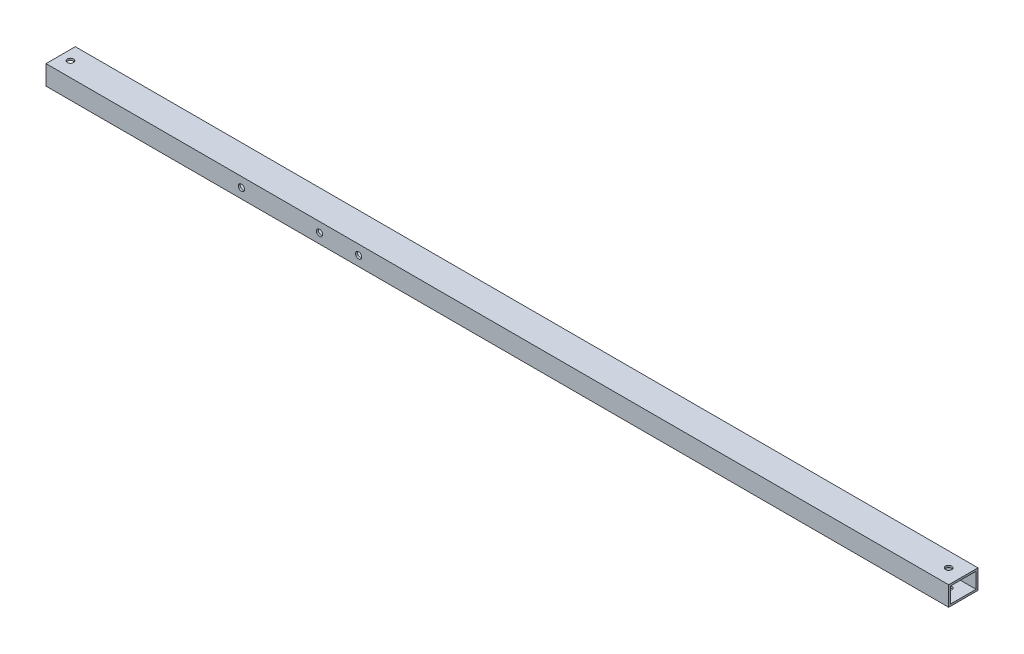
ISO-10303-21;
HEADER;
FILE_DESCRIPTION(('STEP AP214'),'2;1');
FILE_NAME('part.step','',(''),(''),'','','');
FILE_SCHEMA(('AUTOMOTIVE_DESIGN { 1 0 10303 214 1 1 1 1 }'));
ENDSEC;
DATA;
#1=APPLICATION_CONTEXT('core data for automotive mechanical design processes');
#2=APPLICATION_PROTOCOL_DEFINITION('international standard','automotive_design',2000,#1);
#3=PRODUCT_CONTEXT('',#1,'mechanical');
#4=PRODUCT('Part','Part','',(#3));
#5=PRODUCT_RELATED_PRODUCT_CATEGORY('part','',(#4));
#6=PRODUCT_DEFINITION_FORMATION('','',#4);
#7=PRODUCT_DEFINITION_CONTEXT('part definition',#1,'design');
#8=PRODUCT_DEFINITION('design','',#6,#7);
#9=PRODUCT_DEFINITION_SHAPE('','',#8);
#10=(LENGTH_UNIT() NAMED_UNIT(*) SI_UNIT(.MILLI.,.METRE.));
#11=(NAMED_UNIT(*) PLANE_ANGLE_UNIT() SI_UNIT($,.RADIAN.));
#12=(NAMED_UNIT(*) SI_UNIT($,.STERADIAN.) SOLID_ANGLE_UNIT());
#13=UNCERTAINTY_MEASURE_WITH_UNIT(LENGTH_MEASURE(1.E-05),#10,'distance_accuracy_value','');
#14=(GEOMETRIC_REPRESENTATION_CONTEXT(3) GLOBAL_UNCERTAINTY_ASSIGNED_CONTEXT((#13)) GLOBAL_UNIT_ASSIGNED_CONTEXT((#10,
#11,#12)) REPRESENTATION_CONTEXT('',''));
#15=CARTESIAN_POINT('',(0.,0.,0.));
#16=DIRECTION('',(0.,0.,1.));
#17=DIRECTION('',(1.,0.,0.));
#18=AXIS2_PLACEMENT_3D('',#15,#16,#17);
#19=CARTESIAN_POINT('',(-265.5,5.00000000000003,7.5));
#20=DIRECTION('',(0.,-1.,0.));
#21=DIRECTION('',(1.,0.,0.));
#22=AXIS2_PLACEMENT_3D('',#19,#20,#21);
#23=CYLINDRICAL_SURFACE('',#22,1.59999999999996);
#24=CARTESIAN_POINT('',(-265.5,-4.00000000000003,7.5));
#25=DIRECTION('',(0.,-1.,0.));
#26=DIRECTION('',(0.,0.,-1.));
#27=AXIS2_PLACEMENT_3D('',#24,#25,#26);
#28=CIRCLE('',#27,1.59999999999996);
#29=CARTESIAN_POINT('',(-265.5,-4.00000000000003,5.90000000000003));
#30=VERTEX_POINT('',#29);
#31=EDGE_CURVE('E115',#30,#30,#28,.F.);
#32=ORIENTED_EDGE('',*,*,#31,.T.);
#33=EDGE_LOOP('',(#32));
#34=FACE_BOUND('',#33,.T.);
#35=CARTESIAN_POINT('',(-265.5,-4.99999999999997,7.5));
#36=DIRECTION('',(0.,-1.,0.));
#37=DIRECTION('',(1.,0.,0.));
#38=AXIS2_PLACEMENT_3D('',#35,#36,#37);
#39=CIRCLE('',#38,1.59999999999996);
#40=CARTESIAN_POINT('',(-263.9,-4.99999999999997,7.5));
#41=VERTEX_POINT('',#40);
#42=EDGE_CURVE('E125',#41,#41,#39,.T.);
#43=ORIENTED_EDGE('',*,*,#42,.T.);
#44=EDGE_LOOP('',(#43));
#45=FACE_BOUND('',#44,.T.);
#46=ADVANCED_FACE('F33',(#34,#45),#23,.F.);
#47=CARTESIAN_POINT('',(-620.,0.,15.));
#48=DIRECTION('',(0.,0.,-1.));
#49=DIRECTION('',(-1.,0.,0.));
#50=AXIS2_PLACEMENT_3D('',#47,#48,#49);
#51=CYLINDRICAL_SURFACE('',#50,1.60000000000002);
#52=CARTESIAN_POINT('',(-620.,0.,1.));
#53=DIRECTION('',(0.,0.,-1.));
#54=DIRECTION('',(0.,1.,0.));
#55=AXIS2_PLACEMENT_3D('',#52,#53,#54);
#56=CIRCLE('',#55,1.60000000000002);
#57=CARTESIAN_POINT('',(-620.,1.60000000000002,1.));
#58=VERTEX_POINT('',#57);
#59=EDGE_CURVE('E170',#58,#58,#56,.T.);
#60=ORIENTED_EDGE('',*,*,#59,.F.);
#61=EDGE_LOOP('',(#60));
#62=FACE_BOUND('',#61,.T.);
#63=CARTESIAN_POINT('',(-620.,0.,0.));
#64=DIRECTION('',(0.,0.,1.));
#65=DIRECTION('',(1.,0.,0.));
#66=AXIS2_PLACEMENT_3D('',#63,#64,#65);
#67=CIRCLE('',#66,1.60000000000002);
#68=CARTESIAN_POINT('',(-618.4,0.,0.));
#69=VERTEX_POINT('',#68);
#70=EDGE_CURVE('E185',#69,#69,#67,.T.);
#71=ORIENTED_EDGE('',*,*,#70,.F.);
#72=EDGE_LOOP('',(#71));
#73=FACE_BOUND('',#72,.T.);
#74=ADVANCED_FACE('F264',(#62,#73),#51,.F.);
#75=CARTESIAN_POINT('',(-580.,0.,15.));
#76=DIRECTION('',(0.,0.,-1.));
#77=DIRECTION('',(-1.,0.,0.));
#78=AXIS2_PLACEMENT_3D('',#75,#76,#77);
#79=CYLINDRICAL_SURFACE('',#78,1.59999999999991);
#80=CARTESIAN_POINT('',(-580.,0.,1.));
#81=DIRECTION('',(0.,0.,-1.));
#82=DIRECTION('',(0.,1.,0.));
#83=AXIS2_PLACEMENT_3D('',#80,#81,#82);
#84=CIRCLE('',#83,1.59999999999991);
#85=CARTESIAN_POINT('',(-580.,1.59999999999991,1.));
#86=VERTEX_POINT('',#85);
#87=EDGE_CURVE('E167',#86,#86,#84,.T.);
#88=ORIENTED_EDGE('',*,*,#87,.F.);
#89=EDGE_LOOP('',(#88));
#90=FACE_BOUND('',#89,.T.);
#91=CARTESIAN_POINT('',(-580.,0.,0.));
#92=DIRECTION('',(0.,0.,1.));
#93=DIRECTION('',(1.,0.,0.));
#94=AXIS2_PLACEMENT_3D('',#91,#92,#93);
#95=CIRCLE('',#94,1.59999999999991);
#96=CARTESIAN_POINT('',(-578.4,0.,0.));
#97=VERTEX_POINT('',#96);
#98=EDGE_CURVE('E179',#97,#97,#95,.T.);
#99=ORIENTED_EDGE('',*,*,#98,.F.);
#100=EDGE_LOOP('',(#99));
#101=FACE_BOUND('',#100,.T.);
#102=ADVANCED_FACE('F271',(#90,#101),#79,.F.);
#103=CARTESIAN_POINT('',(-560.,0.,15.));
#104=DIRECTION('',(0.,0.,-1.));
#105=DIRECTION('',(-1.,0.,0.));
#106=AXIS2_PLACEMENT_3D('',#103,#104,#105);
#107=CYLINDRICAL_SURFACE('',#106,1.60000000000002);
#108=CARTESIAN_POINT('',(-560.,0.,1.));
#109=DIRECTION('',(0.,0.,-1.));
#110=DIRECTION('',(0.,1.,0.));
#111=AXIS2_PLACEMENT_3D('',#108,#109,#110);
#112=CIRCLE('',#111,1.60000000000002);
#113=CARTESIAN_POINT('',(-560.,1.60000000000002,1.));
#114=VERTEX_POINT('',#113);
#115=EDGE_CURVE('E166',#114,#114,#112,.T.);
#116=ORIENTED_EDGE('',*,*,#115,.F.);
#117=EDGE_LOOP('',(#116));
#118=FACE_BOUND('',#117,.T.);
#119=CARTESIAN_POINT('',(-560.,0.,0.));
#120=DIRECTION('',(0.,0.,1.));
#121=DIRECTION('',(1.,0.,0.));
#122=AXIS2_PLACEMENT_3D('',#119,#120,#121);
#123=CIRCLE('',#122,1.60000000000002);
#124=CARTESIAN_POINT('',(-558.4,0.,0.));
#125=VERTEX_POINT('',#124);
#126=EDGE_CURVE('E175',#125,#125,#123,.T.);
#127=ORIENTED_EDGE('',*,*,#126,.F.);
#128=EDGE_LOOP('',(#127));
#129=FACE_BOUND('',#128,.T.);
#130=ADVANCED_FACE('F291',(#118,#129),#107,.F.);
#131=CARTESIAN_POINT('',(0.,0.,15.));
#132=DIRECTION('',(0.,0.,-1.));
#133=DIRECTION('',(-1.,0.,0.));
#134=AXIS2_PLACEMENT_3D('',#131,#132,#133);
#135=PLANE('',#134);
#136=DIRECTION('',(1.,0.,0.));
#137=VECTOR('',#136,1.);
#138=CARTESIAN_POINT('',(-500.,-5.,15.));
#139=LINE('',#138,#137);
#140=CARTESIAN_POINT('',(-720.,-5.00000000000003,15.));
#141=VERTEX_POINT('',#140);
#142=CARTESIAN_POINT('',(-258.,-4.99999999999997,15.));
#143=VERTEX_POINT('',#142);
#144=EDGE_CURVE('E199',#141,#143,#139,.T.);
#145=ORIENTED_EDGE('',*,*,#144,.T.);
#146=DIRECTION('',(0.,-1.,0.));
#147=VECTOR('',#146,1.);
#148=CARTESIAN_POINT('',(-258.,5.00000000000003,15.));
#149=LINE('',#148,#147);
#150=CARTESIAN_POINT('',(-258.,5.00000000000003,15.));
#151=VERTEX_POINT('',#150);
#152=EDGE_CURVE('E138',#151,#143,#149,.T.);
#153=ORIENTED_EDGE('',*,*,#152,.F.);
#154=DIRECTION('',(-1.,0.,0.));
#155=VECTOR('',#154,1.);
#156=CARTESIAN_POINT('',(-500.,5.,15.));
#157=LINE('',#156,#155);
#158=CARTESIAN_POINT('',(-720.,4.99999999999997,15.));
#159=VERTEX_POINT('',#158);
#160=EDGE_CURVE('E194',#151,#159,#157,.T.);
#161=ORIENTED_EDGE('',*,*,#160,.T.);
#162=DIRECTION('',(0.,-1.,0.));
#163=VECTOR('',#162,1.);
#164=CARTESIAN_POINT('',(-720.,4.99999999999997,15.));
#165=LINE('',#164,#163);
#166=EDGE_CURVE('E196',#159,#141,#165,.T.);
#167=ORIENTED_EDGE('',*,*,#166,.T.);
#168=EDGE_LOOP('',(#145,#153,#161,#167));
#169=FACE_BOUND('',#168,.T.);
#170=CARTESIAN_POINT('',(-620.,0.,15.));
#171=DIRECTION('',(0.,0.,1.));
#172=DIRECTION('',(1.,0.,0.));
#173=AXIS2_PLACEMENT_3D('',#170,#171,#172);
#174=CIRCLE('',#173,1.60000000000002);
#175=CARTESIAN_POINT('',(-618.4,0.,15.));
#176=VERTEX_POINT('',#175);
#177=EDGE_CURVE('E188',#176,#176,#174,.T.);
#178=ORIENTED_EDGE('',*,*,#177,.F.);
#179=EDGE_LOOP('',(#178));
#180=FACE_BOUND('',#179,.T.);
#181=CARTESIAN_POINT('',(-580.,0.,15.));
#182=DIRECTION('',(0.,0.,1.));
#183=DIRECTION('',(1.,0.,0.));
#184=AXIS2_PLACEMENT_3D('',#181,#182,#183);
#185=CIRCLE('',#184,1.59999999999991);
#186=CARTESIAN_POINT('',(-578.4,0.,15.));
#187=VERTEX_POINT('',#186);
#188=EDGE_CURVE('E182',#187,#187,#185,.T.);
#189=ORIENTED_EDGE('',*,*,#188,.F.);
#190=EDGE_LOOP('',(#189));
#191=FACE_BOUND('',#190,.T.);
#192=CARTESIAN_POINT('',(-560.,0.,15.));
#193=DIRECTION('',(0.,0.,1.));
#194=DIRECTION('',(1.,0.,0.));
#195=AXIS2_PLACEMENT_3D('',#192,#193,#194);
#196=CIRCLE('',#195,1.60000000000002);
#197=CARTESIAN_POINT('',(-558.4,0.,15.));
#198=VERTEX_POINT('',#197);
#199=EDGE_CURVE('E176',#198,#198,#196,.T.);
#200=ORIENTED_EDGE('',*,*,#199,.F.);
#201=EDGE_LOOP('',(#200));
#202=FACE_BOUND('',#201,.T.);
#203=ADVANCED_FACE('F246',(#169,#180,#191,#202),#135,.F.);
#204=CARTESIAN_POINT('',(0.,0.,0.));
#205=DIRECTION('',(0.,0.,-1.));
#206=DIRECTION('',(-1.,0.,0.));
#207=AXIS2_PLACEMENT_3D('',#204,#205,#206);
#208=PLANE('',#207);
#209=ORIENTED_EDGE('',*,*,#98,.T.);
#210=EDGE_LOOP('',(#209));
#211=FACE_BOUND('',#210,.T.);
#212=DIRECTION('',(-1.,0.,0.));
#213=VECTOR('',#212,1.);
#214=CARTESIAN_POINT('',(-500.,5.,0.));
#215=LINE('',#214,#213);
#216=CARTESIAN_POINT('',(-258.,5.00000000000003,0.));
#217=VERTEX_POINT('',#216);
#218=CARTESIAN_POINT('',(-720.,4.99999999999997,0.));
#219=VERTEX_POINT('',#218);
#220=EDGE_CURVE('E191',#217,#219,#215,.T.);
#221=ORIENTED_EDGE('',*,*,#220,.F.);
#222=DIRECTION('',(0.,-1.,0.));
#223=VECTOR('',#222,1.);
#224=CARTESIAN_POINT('',(-258.,5.00000000000003,0.));
#225=LINE('',#224,#223);
#226=CARTESIAN_POINT('',(-258.,-4.99999999999997,0.));
#227=VERTEX_POINT('',#226);
#228=EDGE_CURVE('E135',#217,#227,#225,.T.);
#229=ORIENTED_EDGE('',*,*,#228,.T.);
#230=DIRECTION('',(1.,0.,0.));
#231=VECTOR('',#230,1.);
#232=CARTESIAN_POINT('',(-500.,-5.,0.));
#233=LINE('',#232,#231);
#234=CARTESIAN_POINT('',(-720.,-5.00000000000003,0.));
#235=VERTEX_POINT('',#234);
#236=EDGE_CURVE('E197',#235,#227,#233,.T.);
#237=ORIENTED_EDGE('',*,*,#236,.F.);
#238=DIRECTION('',(0.,-1.,0.));
#239=VECTOR('',#238,1.);
#240=CARTESIAN_POINT('',(-720.,4.99999999999997,0.));
#241=LINE('',#240,#239);
#242=EDGE_CURVE('E203',#219,#235,#241,.T.);
#243=ORIENTED_EDGE('',*,*,#242,.F.);
#244=EDGE_LOOP('',(#221,#229,#237,#243));
#245=FACE_BOUND('',#244,.T.);
#246=ORIENTED_EDGE('',*,*,#70,.T.);
#247=EDGE_LOOP('',(#246));
#248=FACE_BOUND('',#247,.T.);
#249=ORIENTED_EDGE('',*,*,#126,.T.);
#250=EDGE_LOOP('',(#249));
#251=FACE_BOUND('',#250,.T.);
#252=ADVANCED_FACE('F239',(#211,#245,#248,#251),#208,.T.);
#253=CARTESIAN_POINT('',(-500.,5.,15.));
#254=DIRECTION('',(0.,-1.,0.));
#255=DIRECTION('',(1.,0.,0.));
#256=AXIS2_PLACEMENT_3D('',#253,#254,#255);
#257=PLANE('',#256);
#258=CARTESIAN_POINT('',(-715.,5.,7.5));
#259=DIRECTION('',(0.,-1.,0.));
#260=DIRECTION('',(1.,0.,0.));
#261=AXIS2_PLACEMENT_3D('',#258,#259,#260);
#262=CIRCLE('',#261,1.60000000000002);
#263=CARTESIAN_POINT('',(-713.4,5.,7.5));
#264=VERTEX_POINT('',#263);
#265=EDGE_CURVE('E104',#264,#264,#262,.T.);
#266=ORIENTED_EDGE('',*,*,#265,.T.);
#267=EDGE_LOOP('',(#266));
#268=FACE_BOUND('',#267,.T.);
#269=ORIENTED_EDGE('',*,*,#220,.T.);
#270=DIRECTION('',(0.,0.,-1.));
#271=VECTOR('',#270,1.);
#272=CARTESIAN_POINT('',(-720.,4.99999999999997,15.));
#273=LINE('',#272,#271);
#274=EDGE_CURVE('E208',#159,#219,#273,.T.);
#275=ORIENTED_EDGE('',*,*,#274,.F.);
#276=ORIENTED_EDGE('',*,*,#160,.F.);
#277=DIRECTION('',(0.,0.,1.));
#278=VECTOR('',#277,1.);
#279=CARTESIAN_POINT('',(-258.,5.00000000000003,0.));
#280=LINE('',#279,#278);
#281=EDGE_CURVE('E132',#217,#151,#280,.T.);
#282=ORIENTED_EDGE('',*,*,#281,.F.);
#283=EDGE_LOOP('',(#269,#275,#276,#282));
#284=FACE_BOUND('',#283,.T.);
#285=CARTESIAN_POINT('',(-265.5,5.00000000000003,7.5));
#286=DIRECTION('',(0.,-1.,0.));
#287=DIRECTION('',(1.,0.,0.));
#288=AXIS2_PLACEMENT_3D('',#285,#286,#287);
#289=CIRCLE('',#288,1.59999999999996);
#290=CARTESIAN_POINT('',(-263.9,5.00000000000003,7.5));
#291=VERTEX_POINT('',#290);
#292=EDGE_CURVE('E126',#291,#291,#289,.T.);
#293=ORIENTED_EDGE('',*,*,#292,.T.);
#294=EDGE_LOOP('',(#293));
#295=FACE_BOUND('',#294,.T.);
#296=ADVANCED_FACE('F35',(#268,#284,#295),#257,.F.);
#297=CARTESIAN_POINT('',(-720.,4.99999999999997,15.));
#298=DIRECTION('',(1.,0.,0.));
#299=DIRECTION('',(0.,0.,-1.));
#300=AXIS2_PLACEMENT_3D('',#297,#298,#299);
#301=PLANE('',#300);
#302=DIRECTION('',(0.,0.,-1.));
#303=VECTOR('',#302,1.);
#304=CARTESIAN_POINT('',(-720.,-4.,15.));
#305=LINE('',#304,#303);
#306=CARTESIAN_POINT('',(-720.,-4.,14.));
#307=VERTEX_POINT('',#306);
#308=CARTESIAN_POINT('',(-720.,-4.,0.999999999999999));
#309=VERTEX_POINT('',#308);
#310=EDGE_CURVE('E216',#307,#309,#305,.T.);
#311=ORIENTED_EDGE('',*,*,#310,.T.);
#312=DIRECTION('',(0.,1.,0.));
#313=VECTOR('',#312,1.);
#314=CARTESIAN_POINT('',(-720.,4.99999999999998,1.));
#315=LINE('',#314,#313);
#316=CARTESIAN_POINT('',(-720.,4.,1.));
#317=VERTEX_POINT('',#316);
#318=EDGE_CURVE('E173',#309,#317,#315,.T.);
#319=ORIENTED_EDGE('',*,*,#318,.T.);
#320=DIRECTION('',(0.,0.,1.));
#321=VECTOR('',#320,1.);
#322=CARTESIAN_POINT('',(-720.,4.,15.));
#323=LINE('',#322,#321);
#324=CARTESIAN_POINT('',(-720.,4.,14.));
#325=VERTEX_POINT('',#324);
#326=EDGE_CURVE('E101',#317,#325,#323,.T.);
#327=ORIENTED_EDGE('',*,*,#326,.T.);
#328=DIRECTION('',(0.,-1.,0.));
#329=VECTOR('',#328,1.);
#330=CARTESIAN_POINT('',(-720.,4.99999999999998,14.));
#331=LINE('',#330,#329);
#332=EDGE_CURVE('E163',#325,#307,#331,.T.);
#333=ORIENTED_EDGE('',*,*,#332,.T.);
#334=EDGE_LOOP('',(#311,#319,#327,#333));
#335=FACE_BOUND('',#334,.T.);
#336=ORIENTED_EDGE('',*,*,#242,.T.);
#337=DIRECTION('',(0.,0.,-1.));
#338=VECTOR('',#337,1.);
#339=CARTESIAN_POINT('',(-720.,-5.00000000000003,15.));
#340=LINE('',#339,#338);
#341=EDGE_CURVE('E201',#141,#235,#340,.T.);
#342=ORIENTED_EDGE('',*,*,#341,.F.);
#343=ORIENTED_EDGE('',*,*,#166,.F.);
#344=ORIENTED_EDGE('',*,*,#274,.T.);
#345=EDGE_LOOP('',(#336,#342,#343,#344));
#346=FACE_BOUND('',#345,.T.);
#347=ADVANCED_FACE('F226',(#335,#346),#301,.F.);
#348=CARTESIAN_POINT('',(-500.,-5.,15.));
#349=DIRECTION('',(0.,1.,0.));
#350=DIRECTION('',(-1.,0.,0.));
#351=AXIS2_PLACEMENT_3D('',#348,#349,#350);
#352=PLANE('',#351);
#353=CARTESIAN_POINT('',(-715.,-5.00000000000003,7.5));
#354=DIRECTION('',(0.,-1.,0.));
#355=DIRECTION('',(1.,0.,0.));
#356=AXIS2_PLACEMENT_3D('',#353,#354,#355);
#357=CIRCLE('',#356,1.60000000000002);
#358=CARTESIAN_POINT('',(-713.4,-5.00000000000003,7.5));
#359=VERTEX_POINT('',#358);
#360=EDGE_CURVE('E141',#359,#359,#357,.T.);
#361=ORIENTED_EDGE('',*,*,#360,.F.);
#362=EDGE_LOOP('',(#361));
#363=FACE_BOUND('',#362,.T.);
#364=ORIENTED_EDGE('',*,*,#236,.T.);
#365=DIRECTION('',(0.,0.,1.));
#366=VECTOR('',#365,1.);
#367=CARTESIAN_POINT('',(-258.,-4.99999999999997,0.));
#368=LINE('',#367,#366);
#369=EDGE_CURVE('E129',#227,#143,#368,.T.);
#370=ORIENTED_EDGE('',*,*,#369,.T.);
#371=ORIENTED_EDGE('',*,*,#144,.F.);
#372=ORIENTED_EDGE('',*,*,#341,.T.);
#373=EDGE_LOOP('',(#364,#370,#371,#372));
#374=FACE_BOUND('',#373,.T.);
#375=ORIENTED_EDGE('',*,*,#42,.F.);
#376=EDGE_LOOP('',(#375));
#377=FACE_BOUND('',#376,.T.);
#378=ADVANCED_FACE('F229',(#363,#374,#377),#352,.F.);
#379=CARTESIAN_POINT('',(-620.,0.,14.));
#380=DIRECTION('',(0.,0.,1.));
#381=DIRECTION('',(0.,-1.,0.));
#382=AXIS2_PLACEMENT_3D('',#379,#380,#381);
#383=CIRCLE('',#382,1.60000000000002);
#384=CARTESIAN_POINT('',(-620.,-1.60000000000002,14.));
#385=VERTEX_POINT('',#384);
#386=EDGE_CURVE('E160',#385,#385,#383,.T.);
#387=ORIENTED_EDGE('',*,*,#386,.F.);
#388=EDGE_LOOP('',(#387));
#389=FACE_BOUND('',#388,.T.);
#390=ORIENTED_EDGE('',*,*,#177,.T.);
#391=EDGE_LOOP('',(#390));
#392=FACE_BOUND('',#391,.T.);
#393=ADVANCED_FACE('F274',(#389,#392),#51,.F.);
#394=CARTESIAN_POINT('',(-580.,0.,14.));
#395=DIRECTION('',(0.,0.,1.));
#396=DIRECTION('',(0.,-1.,0.));
#397=AXIS2_PLACEMENT_3D('',#394,#395,#396);
#398=CIRCLE('',#397,1.59999999999991);
#399=CARTESIAN_POINT('',(-580.,-1.59999999999991,14.));
#400=VERTEX_POINT('',#399);
#401=EDGE_CURVE('E157',#400,#400,#398,.T.);
#402=ORIENTED_EDGE('',*,*,#401,.F.);
#403=EDGE_LOOP('',(#402));
#404=FACE_BOUND('',#403,.T.);
#405=ORIENTED_EDGE('',*,*,#188,.T.);
#406=EDGE_LOOP('',(#405));
#407=FACE_BOUND('',#406,.T.);
#408=ADVANCED_FACE('F283',(#404,#407),#79,.F.);
#409=CARTESIAN_POINT('',(-560.,0.,14.));
#410=DIRECTION('',(0.,0.,1.));
#411=DIRECTION('',(0.,-1.,0.));
#412=AXIS2_PLACEMENT_3D('',#409,#410,#411);
#413=CIRCLE('',#412,1.60000000000002);
#414=CARTESIAN_POINT('',(-560.,-1.60000000000002,14.));
#415=VERTEX_POINT('',#414);
#416=EDGE_CURVE('E153',#415,#415,#413,.T.);
#417=ORIENTED_EDGE('',*,*,#416,.F.);
#418=EDGE_LOOP('',(#417));
#419=FACE_BOUND('',#418,.T.);
#420=ORIENTED_EDGE('',*,*,#199,.T.);
#421=EDGE_LOOP('',(#420));
#422=FACE_BOUND('',#421,.T.);
#423=ADVANCED_FACE('F295',(#419,#422),#107,.F.);
#424=CARTESIAN_POINT('',(-2500.,-4.,0.999999999999999));
#425=DIRECTION('',(0.,-1.,0.));
#426=DIRECTION('',(0.,0.,-1.));
#427=AXIS2_PLACEMENT_3D('',#424,#425,#426);
#428=PLANE('',#427);
#429=CARTESIAN_POINT('',(-715.,-4.,7.5));
#430=DIRECTION('',(0.,-1.,0.));
#431=DIRECTION('',(0.,0.,-1.));
#432=AXIS2_PLACEMENT_3D('',#429,#430,#431);
#433=CIRCLE('',#432,1.60000000000002);
#434=CARTESIAN_POINT('',(-715.,-4.,5.89999999999998));
#435=VERTEX_POINT('',#434);
#436=EDGE_CURVE('E147',#435,#435,#433,.T.);
#437=ORIENTED_EDGE('',*,*,#436,.T.);
#438=EDGE_LOOP('',(#437));
#439=FACE_BOUND('',#438,.T.);
#440=DIRECTION('',(1.,0.,0.));
#441=VECTOR('',#440,1.);
#442=CARTESIAN_POINT('',(-2500.,-4.,14.));
#443=LINE('',#442,#441);
#444=CARTESIAN_POINT('',(-258.,-4.00000000000003,14.));
#445=VERTEX_POINT('',#444);
#446=EDGE_CURVE('E154',#307,#445,#443,.T.);
#447=ORIENTED_EDGE('',*,*,#446,.T.);
#448=DIRECTION('',(0.,0.,-1.));
#449=VECTOR('',#448,1.);
#450=CARTESIAN_POINT('',(-258.,-4.00000000000003,0.));
#451=LINE('',#450,#449);
#452=CARTESIAN_POINT('',(-258.,-4.00000000000003,1.));
#453=VERTEX_POINT('',#452);
#454=EDGE_CURVE('E119',#445,#453,#451,.T.);
#455=ORIENTED_EDGE('',*,*,#454,.T.);
#456=DIRECTION('',(1.,0.,0.));
#457=VECTOR('',#456,1.);
#458=CARTESIAN_POINT('',(-2500.,-4.,0.999999999999999));
#459=LINE('',#458,#457);
#460=EDGE_CURVE('E109',#309,#453,#459,.T.);
#461=ORIENTED_EDGE('',*,*,#460,.F.);
#462=ORIENTED_EDGE('',*,*,#310,.F.);
#463=EDGE_LOOP('',(#447,#455,#461,#462));
#464=FACE_BOUND('',#463,.T.);
#465=ORIENTED_EDGE('',*,*,#31,.F.);
#466=EDGE_LOOP('',(#465));
#467=FACE_BOUND('',#466,.T.);
#468=ADVANCED_FACE('F223',(#439,#464,#467),#428,.F.);
#469=CARTESIAN_POINT('',(-2500.,4.,1.));
#470=DIRECTION('',(0.,1.,0.));
#471=DIRECTION('',(0.,0.,1.));
#472=AXIS2_PLACEMENT_3D('',#469,#470,#471);
#473=PLANE('',#472);
#474=CARTESIAN_POINT('',(-715.,4.,7.5));
#475=DIRECTION('',(0.,1.,0.));
#476=DIRECTION('',(0.,0.,1.));
#477=AXIS2_PLACEMENT_3D('',#474,#475,#476);
#478=CIRCLE('',#477,1.60000000000002);
#479=CARTESIAN_POINT('',(-715.,4.,9.10000000000002));
#480=VERTEX_POINT('',#479);
#481=EDGE_CURVE('E146',#480,#480,#478,.T.);
#482=ORIENTED_EDGE('',*,*,#481,.T.);
#483=EDGE_LOOP('',(#482));
#484=FACE_BOUND('',#483,.T.);
#485=DIRECTION('',(1.,0.,0.));
#486=VECTOR('',#485,1.);
#487=CARTESIAN_POINT('',(-2500.,4.,1.));
#488=LINE('',#487,#486);
#489=CARTESIAN_POINT('',(-258.,3.99999999999997,1.));
#490=VERTEX_POINT('',#489);
#491=EDGE_CURVE('E94',#317,#490,#488,.T.);
#492=ORIENTED_EDGE('',*,*,#491,.T.);
#493=DIRECTION('',(0.,0.,1.));
#494=VECTOR('',#493,1.);
#495=CARTESIAN_POINT('',(-258.,3.99999999999997,0.));
#496=LINE('',#495,#494);
#497=CARTESIAN_POINT('',(-258.,3.99999999999997,14.));
#498=VERTEX_POINT('',#497);
#499=EDGE_CURVE('E98',#490,#498,#496,.T.);
#500=ORIENTED_EDGE('',*,*,#499,.T.);
#501=DIRECTION('',(1.,0.,0.));
#502=VECTOR('',#501,1.);
#503=CARTESIAN_POINT('',(-2500.,4.,14.));
#504=LINE('',#503,#502);
#505=EDGE_CURVE('E48',#325,#498,#504,.T.);
#506=ORIENTED_EDGE('',*,*,#505,.F.);
#507=ORIENTED_EDGE('',*,*,#326,.F.);
#508=EDGE_LOOP('',(#492,#500,#506,#507));
#509=FACE_BOUND('',#508,.T.);
#510=CARTESIAN_POINT('',(-265.5,3.99999999999997,7.5));
#511=DIRECTION('',(0.,1.,0.));
#512=DIRECTION('',(0.,0.,1.));
#513=AXIS2_PLACEMENT_3D('',#510,#511,#512);
#514=CIRCLE('',#513,1.59999999999996);
#515=CARTESIAN_POINT('',(-265.5,3.99999999999997,9.09999999999996));
#516=VERTEX_POINT('',#515);
#517=EDGE_CURVE('E116',#516,#516,#514,.F.);
#518=ORIENTED_EDGE('',*,*,#517,.F.);
#519=EDGE_LOOP('',(#518));
#520=FACE_BOUND('',#519,.T.);
#521=ADVANCED_FACE('F95',(#484,#509,#520),#473,.F.);
#522=CARTESIAN_POINT('',(-2500.,4.,1.));
#523=DIRECTION('',(0.,0.,-1.));
#524=DIRECTION('',(0.,1.,0.));
#525=AXIS2_PLACEMENT_3D('',#522,#523,#524);
#526=PLANE('',#525);
#527=ORIENTED_EDGE('',*,*,#59,.T.);
#528=EDGE_LOOP('',(#527));
#529=FACE_BOUND('',#528,.T.);
#530=ORIENTED_EDGE('',*,*,#87,.T.);
#531=EDGE_LOOP('',(#530));
#532=FACE_BOUND('',#531,.T.);
#533=ORIENTED_EDGE('',*,*,#115,.T.);
#534=EDGE_LOOP('',(#533));
#535=FACE_BOUND('',#534,.T.);
#536=ORIENTED_EDGE('',*,*,#460,.T.);
#537=DIRECTION('',(0.,1.,0.));
#538=VECTOR('',#537,1.);
#539=CARTESIAN_POINT('',(-258.,5.00000000000003,1.));
#540=LINE('',#539,#538);
#541=EDGE_CURVE('E11',#453,#490,#540,.T.);
#542=ORIENTED_EDGE('',*,*,#541,.T.);
#543=ORIENTED_EDGE('',*,*,#491,.F.);
#544=ORIENTED_EDGE('',*,*,#318,.F.);
#545=EDGE_LOOP('',(#536,#542,#543,#544));
#546=FACE_BOUND('',#545,.T.);
#547=ADVANCED_FACE('F107',(#529,#532,#535,#546),#526,.F.);
#548=CARTESIAN_POINT('',(-2500.,4.,14.));
#549=DIRECTION('',(0.,0.,1.));
#550=DIRECTION('',(0.,-1.,0.));
#551=AXIS2_PLACEMENT_3D('',#548,#549,#550);
#552=PLANE('',#551);
#553=ORIENTED_EDGE('',*,*,#386,.T.);
#554=EDGE_LOOP('',(#553));
#555=FACE_BOUND('',#554,.T.);
#556=ORIENTED_EDGE('',*,*,#401,.T.);
#557=EDGE_LOOP('',(#556));
#558=FACE_BOUND('',#557,.T.);
#559=ORIENTED_EDGE('',*,*,#416,.T.);
#560=EDGE_LOOP('',(#559));
#561=FACE_BOUND('',#560,.T.);
#562=ORIENTED_EDGE('',*,*,#505,.T.);
#563=DIRECTION('',(0.,-1.,0.));
#564=VECTOR('',#563,1.);
#565=CARTESIAN_POINT('',(-258.,5.00000000000003,14.));
#566=LINE('',#565,#564);
#567=EDGE_CURVE('E41',#498,#445,#566,.T.);
#568=ORIENTED_EDGE('',*,*,#567,.T.);
#569=ORIENTED_EDGE('',*,*,#446,.F.);
#570=ORIENTED_EDGE('',*,*,#332,.F.);
#571=EDGE_LOOP('',(#562,#568,#569,#570));
#572=FACE_BOUND('',#571,.T.);
#573=ADVANCED_FACE('F221',(#555,#558,#561,#572),#552,.F.);
#574=CARTESIAN_POINT('',(-715.,995.,7.5));
#575=DIRECTION('',(0.,-1.,0.));
#576=DIRECTION('',(1.,0.,0.));
#577=AXIS2_PLACEMENT_3D('',#574,#575,#576);
#578=CYLINDRICAL_SURFACE('',#577,1.60000000000002);
#579=ORIENTED_EDGE('',*,*,#481,.F.);
#580=EDGE_LOOP('',(#579));
#581=FACE_BOUND('',#580,.T.);
#582=ORIENTED_EDGE('',*,*,#265,.F.);
#583=EDGE_LOOP('',(#582));
#584=FACE_BOUND('',#583,.T.);
#585=ADVANCED_FACE('F308',(#581,#584),#578,.F.);
#586=ORIENTED_EDGE('',*,*,#360,.T.);
#587=EDGE_LOOP('',(#586));
#588=FACE_BOUND('',#587,.T.);
#589=ORIENTED_EDGE('',*,*,#436,.F.);
#590=EDGE_LOOP('',(#589));
#591=FACE_BOUND('',#590,.T.);
#592=ADVANCED_FACE('F261',(#588,#591),#578,.F.);
#593=CARTESIAN_POINT('',(-258.,5.00000000000003,0.));
#594=DIRECTION('',(1.,0.,0.));
#595=DIRECTION('',(0.,1.,0.));
#596=AXIS2_PLACEMENT_3D('',#593,#594,#595);
#597=PLANE('',#596);
#598=ORIENTED_EDGE('',*,*,#454,.F.);
#599=ORIENTED_EDGE('',*,*,#567,.F.);
#600=ORIENTED_EDGE('',*,*,#499,.F.);
#601=ORIENTED_EDGE('',*,*,#541,.F.);
#602=EDGE_LOOP('',(#598,#599,#600,#601));
#603=FACE_BOUND('',#602,.T.);
#604=ORIENTED_EDGE('',*,*,#369,.F.);
#605=ORIENTED_EDGE('',*,*,#228,.F.);
#606=ORIENTED_EDGE('',*,*,#281,.T.);
#607=ORIENTED_EDGE('',*,*,#152,.T.);
#608=EDGE_LOOP('',(#604,#605,#606,#607));
#609=FACE_BOUND('',#608,.T.);
#610=ADVANCED_FACE('F113',(#603,#609),#597,.T.);
#611=ORIENTED_EDGE('',*,*,#517,.T.);
#612=EDGE_LOOP('',(#611));
#613=FACE_BOUND('',#612,.T.);
#614=ORIENTED_EDGE('',*,*,#292,.F.);
#615=EDGE_LOOP('',(#614));
#616=FACE_BOUND('',#615,.T.);
#617=ADVANCED_FACE('F254',(#613,#616),#23,.F.);
#618=CLOSED_SHELL('',(#46,#74,#102,#130,#203,#252,#296,#347,#378,#393,#408,#423,#468,#521,#547,
#573,#585,#592,#610,#617));
#619=MANIFOLD_SOLID_BREP('B2',#618);
#620=ADVANCED_BREP_SHAPE_REPRESENTATION('',(#18,#619),#14);
#621=SHAPE_DEFINITION_REPRESENTATION(#9,#620);
ENDSEC;
END-ISO-10303-21;
